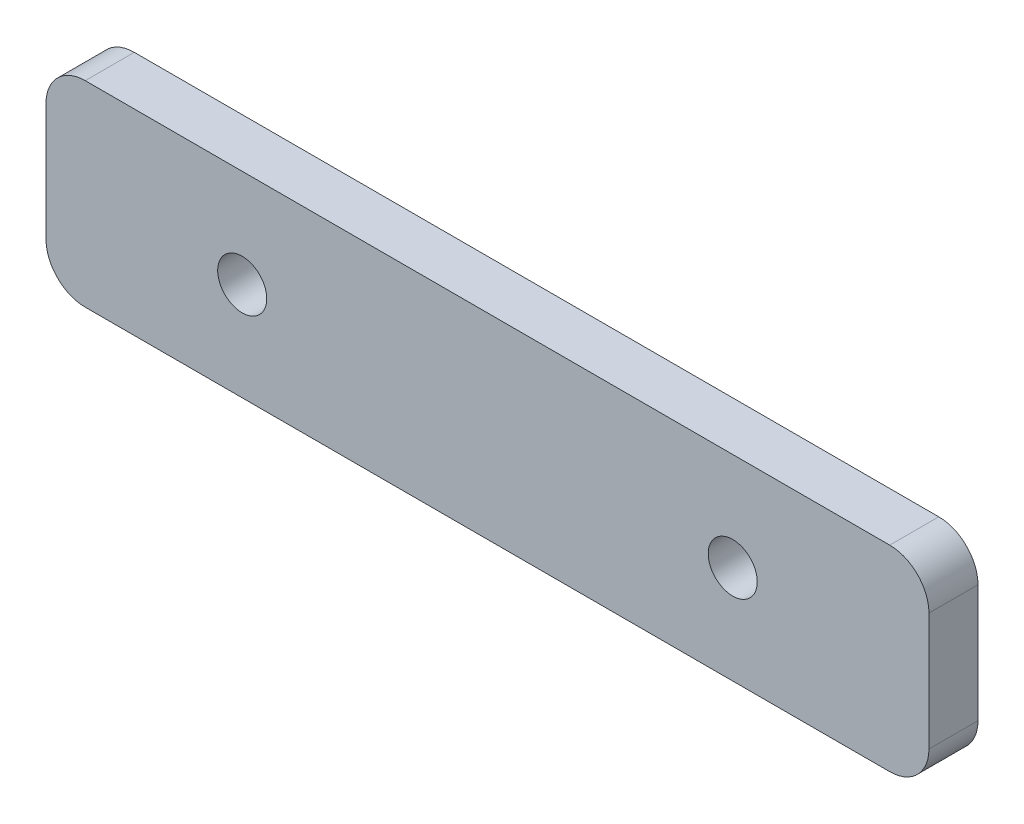
ISO-10303-21;
HEADER;
FILE_DESCRIPTION(('STEP AP214'),'2;1');
FILE_NAME('part.step','',(''),(''),'','','');
FILE_SCHEMA(('AUTOMOTIVE_DESIGN { 1 0 10303 214 1 1 1 1 }'));
ENDSEC;
DATA;
#1=APPLICATION_CONTEXT('core data for automotive mechanical design processes');
#2=APPLICATION_PROTOCOL_DEFINITION('international standard','automotive_design',2000,#1);
#3=PRODUCT_CONTEXT('',#1,'mechanical');
#4=PRODUCT('Part','Part','',(#3));
#5=PRODUCT_RELATED_PRODUCT_CATEGORY('part','',(#4));
#6=PRODUCT_DEFINITION_FORMATION('','',#4);
#7=PRODUCT_DEFINITION_CONTEXT('part definition',#1,'design');
#8=PRODUCT_DEFINITION('design','',#6,#7);
#9=PRODUCT_DEFINITION_SHAPE('','',#8);
#10=(LENGTH_UNIT() NAMED_UNIT(*) SI_UNIT(.MILLI.,.METRE.));
#11=(NAMED_UNIT(*) PLANE_ANGLE_UNIT() SI_UNIT($,.RADIAN.));
#12=(NAMED_UNIT(*) SI_UNIT($,.STERADIAN.) SOLID_ANGLE_UNIT());
#13=UNCERTAINTY_MEASURE_WITH_UNIT(LENGTH_MEASURE(1.E-05),#10,'distance_accuracy_value','');
#14=(GEOMETRIC_REPRESENTATION_CONTEXT(3) GLOBAL_UNCERTAINTY_ASSIGNED_CONTEXT((#13)) GLOBAL_UNIT_ASSIGNED_CONTEXT((#10,
#11,#12)) REPRESENTATION_CONTEXT('',''));
#15=CARTESIAN_POINT('',(0.,0.,0.));
#16=DIRECTION('',(0.,0.,1.));
#17=DIRECTION('',(1.,0.,0.));
#18=AXIS2_PLACEMENT_3D('',#15,#16,#17);
#19=CARTESIAN_POINT('',(0.,0.,3.175));
#20=DIRECTION('',(0.,0.,-1.));
#21=DIRECTION('',(-1.,0.,0.));
#22=AXIS2_PLACEMENT_3D('',#19,#20,#21);
#23=PLANE('',#22);
#24=DIRECTION('',(1.,0.,0.));
#25=VECTOR('',#24,1.);
#26=CARTESIAN_POINT('',(-28.575,-6.35,3.175));
#27=LINE('',#26,#25);
#28=CARTESIAN_POINT('',(-26.035,-6.35,3.175));
#29=VERTEX_POINT('',#28);
#30=CARTESIAN_POINT('',(26.035,-6.35,3.175));
#31=VERTEX_POINT('',#30);
#32=EDGE_CURVE('E140',#29,#31,#27,.T.);
#33=ORIENTED_EDGE('',*,*,#32,.T.);
#34=CARTESIAN_POINT('',(26.035,-3.81,3.175));
#35=DIRECTION('',(0.,0.,-1.));
#36=DIRECTION('',(-1.,0.,0.));
#37=AXIS2_PLACEMENT_3D('',#34,#35,#36);
#38=CIRCLE('',#37,2.54);
#39=CARTESIAN_POINT('',(28.575,-3.81,3.175));
#40=VERTEX_POINT('',#39);
#41=EDGE_CURVE('E158',#31,#40,#38,.F.);
#42=ORIENTED_EDGE('',*,*,#41,.T.);
#43=DIRECTION('',(0.,1.,0.));
#44=VECTOR('',#43,1.);
#45=CARTESIAN_POINT('',(28.575,-6.35,3.175));
#46=LINE('',#45,#44);
#47=CARTESIAN_POINT('',(28.575,3.81,3.175));
#48=VERTEX_POINT('',#47);
#49=EDGE_CURVE('E122',#40,#48,#46,.T.);
#50=ORIENTED_EDGE('',*,*,#49,.T.);
#51=CARTESIAN_POINT('',(26.035,3.81,3.175));
#52=DIRECTION('',(0.,0.,-1.));
#53=DIRECTION('',(-1.,0.,0.));
#54=AXIS2_PLACEMENT_3D('',#51,#52,#53);
#55=CIRCLE('',#54,2.54);
#56=CARTESIAN_POINT('',(26.035,6.35,3.175));
#57=VERTEX_POINT('',#56);
#58=EDGE_CURVE('E154',#48,#57,#55,.F.);
#59=ORIENTED_EDGE('',*,*,#58,.T.);
#60=DIRECTION('',(-1.,0.,0.));
#61=VECTOR('',#60,1.);
#62=CARTESIAN_POINT('',(-28.575,6.35,3.175));
#63=LINE('',#62,#61);
#64=CARTESIAN_POINT('',(-26.035,6.35,3.175));
#65=VERTEX_POINT('',#64);
#66=EDGE_CURVE('E167',#57,#65,#63,.T.);
#67=ORIENTED_EDGE('',*,*,#66,.T.);
#68=CARTESIAN_POINT('',(-26.035,3.81,3.175));
#69=DIRECTION('',(0.,0.,-1.));
#70=DIRECTION('',(-1.,0.,0.));
#71=AXIS2_PLACEMENT_3D('',#68,#69,#70);
#72=CIRCLE('',#71,2.54);
#73=CARTESIAN_POINT('',(-28.575,3.81,3.175));
#74=VERTEX_POINT('',#73);
#75=EDGE_CURVE('E57',#65,#74,#72,.F.);
#76=ORIENTED_EDGE('',*,*,#75,.T.);
#77=DIRECTION('',(0.,-1.,0.));
#78=VECTOR('',#77,1.);
#79=CARTESIAN_POINT('',(-28.575,-6.35,3.175));
#80=LINE('',#79,#78);
#81=CARTESIAN_POINT('',(-28.575,-3.81,3.175));
#82=VERTEX_POINT('',#81);
#83=EDGE_CURVE('E173',#74,#82,#80,.T.);
#84=ORIENTED_EDGE('',*,*,#83,.T.);
#85=CARTESIAN_POINT('',(-26.035,-3.81,3.175));
#86=DIRECTION('',(0.,0.,-1.));
#87=DIRECTION('',(-1.,0.,0.));
#88=AXIS2_PLACEMENT_3D('',#85,#86,#87);
#89=CIRCLE('',#88,2.54);
#90=EDGE_CURVE('E156',#82,#29,#89,.F.);
#91=ORIENTED_EDGE('',*,*,#90,.T.);
#92=EDGE_LOOP('',(#33,#42,#50,#59,#67,#76,#84,#91));
#93=FACE_BOUND('',#92,.T.);
#94=CARTESIAN_POINT('',(-15.875,0.,3.175));
#95=DIRECTION('',(0.,0.,1.));
#96=DIRECTION('',(1.,0.,0.));
#97=AXIS2_PLACEMENT_3D('',#94,#95,#96);
#98=CIRCLE('',#97,1.5875);
#99=CARTESIAN_POINT('',(-14.2875,0.,3.175));
#100=VERTEX_POINT('',#99);
#101=EDGE_CURVE('E131',#100,#100,#98,.T.);
#102=ORIENTED_EDGE('',*,*,#101,.F.);
#103=EDGE_LOOP('',(#102));
#104=FACE_BOUND('',#103,.T.);
#105=CARTESIAN_POINT('',(15.875,0.,3.175));
#106=DIRECTION('',(0.,0.,1.));
#107=DIRECTION('',(1.,0.,0.));
#108=AXIS2_PLACEMENT_3D('',#105,#106,#107);
#109=CIRCLE('',#108,1.5875);
#110=CARTESIAN_POINT('',(17.4625,0.,3.175));
#111=VERTEX_POINT('',#110);
#112=EDGE_CURVE('E188',#111,#111,#109,.T.);
#113=ORIENTED_EDGE('',*,*,#112,.F.);
#114=EDGE_LOOP('',(#113));
#115=FACE_BOUND('',#114,.T.);
#116=ADVANCED_FACE('F35',(#93,#104,#115),#23,.F.);
#117=CARTESIAN_POINT('',(0.,0.,0.));
#118=DIRECTION('',(0.,0.,-1.));
#119=DIRECTION('',(-1.,0.,0.));
#120=AXIS2_PLACEMENT_3D('',#117,#118,#119);
#121=PLANE('',#120);
#122=CARTESIAN_POINT('',(-15.875,0.,0.));
#123=DIRECTION('',(0.,0.,1.));
#124=DIRECTION('',(1.,0.,0.));
#125=AXIS2_PLACEMENT_3D('',#122,#123,#124);
#126=CIRCLE('',#125,1.5875);
#127=CARTESIAN_POINT('',(-14.2875,0.,0.));
#128=VERTEX_POINT('',#127);
#129=EDGE_CURVE('E137',#128,#128,#126,.T.);
#130=ORIENTED_EDGE('',*,*,#129,.T.);
#131=EDGE_LOOP('',(#130));
#132=FACE_BOUND('',#131,.T.);
#133=DIRECTION('',(0.,1.,0.));
#134=VECTOR('',#133,1.);
#135=CARTESIAN_POINT('',(28.575,-6.35,0.));
#136=LINE('',#135,#134);
#137=CARTESIAN_POINT('',(28.575,-3.81,0.));
#138=VERTEX_POINT('',#137);
#139=CARTESIAN_POINT('',(28.575,3.81,0.));
#140=VERTEX_POINT('',#139);
#141=EDGE_CURVE('E119',#138,#140,#136,.T.);
#142=ORIENTED_EDGE('',*,*,#141,.F.);
#143=CARTESIAN_POINT('',(26.035,-3.81,0.));
#144=DIRECTION('',(0.,0.,-1.));
#145=DIRECTION('',(-1.,0.,0.));
#146=AXIS2_PLACEMENT_3D('',#143,#144,#145);
#147=CIRCLE('',#146,2.54);
#148=CARTESIAN_POINT('',(26.035,-6.35,0.));
#149=VERTEX_POINT('',#148);
#150=EDGE_CURVE('E102',#138,#149,#147,.T.);
#151=ORIENTED_EDGE('',*,*,#150,.T.);
#152=DIRECTION('',(1.,0.,0.));
#153=VECTOR('',#152,1.);
#154=CARTESIAN_POINT('',(-28.575,-6.35,0.));
#155=LINE('',#154,#153);
#156=CARTESIAN_POINT('',(-26.035,-6.35,0.));
#157=VERTEX_POINT('',#156);
#158=EDGE_CURVE('E144',#157,#149,#155,.T.);
#159=ORIENTED_EDGE('',*,*,#158,.F.);
#160=CARTESIAN_POINT('',(-26.035,-3.81,0.));
#161=DIRECTION('',(0.,0.,-1.));
#162=DIRECTION('',(-1.,0.,0.));
#163=AXIS2_PLACEMENT_3D('',#160,#161,#162);
#164=CIRCLE('',#163,2.54);
#165=CARTESIAN_POINT('',(-28.575,-3.81,0.));
#166=VERTEX_POINT('',#165);
#167=EDGE_CURVE('E113',#157,#166,#164,.T.);
#168=ORIENTED_EDGE('',*,*,#167,.T.);
#169=DIRECTION('',(0.,-1.,0.));
#170=VECTOR('',#169,1.);
#171=CARTESIAN_POINT('',(-28.575,-6.35,0.));
#172=LINE('',#171,#170);
#173=CARTESIAN_POINT('',(-28.575,3.81,0.));
#174=VERTEX_POINT('',#173);
#175=EDGE_CURVE('E134',#174,#166,#172,.T.);
#176=ORIENTED_EDGE('',*,*,#175,.F.);
#177=CARTESIAN_POINT('',(-26.035,3.81,0.));
#178=DIRECTION('',(0.,0.,-1.));
#179=DIRECTION('',(-1.,0.,0.));
#180=AXIS2_PLACEMENT_3D('',#177,#178,#179);
#181=CIRCLE('',#180,2.54);
#182=CARTESIAN_POINT('',(-26.035,6.35,0.));
#183=VERTEX_POINT('',#182);
#184=EDGE_CURVE('E123',#174,#183,#181,.T.);
#185=ORIENTED_EDGE('',*,*,#184,.T.);
#186=DIRECTION('',(-1.,0.,0.));
#187=VECTOR('',#186,1.);
#188=CARTESIAN_POINT('',(-28.575,6.35,0.));
#189=LINE('',#188,#187);
#190=CARTESIAN_POINT('',(26.035,6.35,0.));
#191=VERTEX_POINT('',#190);
#192=EDGE_CURVE('E130',#191,#183,#189,.T.);
#193=ORIENTED_EDGE('',*,*,#192,.F.);
#194=CARTESIAN_POINT('',(26.035,3.81,0.));
#195=DIRECTION('',(0.,0.,-1.));
#196=DIRECTION('',(-1.,0.,0.));
#197=AXIS2_PLACEMENT_3D('',#194,#195,#196);
#198=CIRCLE('',#197,2.54);
#199=EDGE_CURVE('E129',#191,#140,#198,.T.);
#200=ORIENTED_EDGE('',*,*,#199,.T.);
#201=EDGE_LOOP('',(#142,#151,#159,#168,#176,#185,#193,#200));
#202=FACE_BOUND('',#201,.T.);
#203=CARTESIAN_POINT('',(15.875,0.,0.));
#204=DIRECTION('',(0.,0.,1.));
#205=DIRECTION('',(1.,0.,0.));
#206=AXIS2_PLACEMENT_3D('',#203,#204,#205);
#207=CIRCLE('',#206,1.5875);
#208=CARTESIAN_POINT('',(17.4625,0.,0.));
#209=VERTEX_POINT('',#208);
#210=EDGE_CURVE('E190',#209,#209,#207,.T.);
#211=ORIENTED_EDGE('',*,*,#210,.T.);
#212=EDGE_LOOP('',(#211));
#213=FACE_BOUND('',#212,.T.);
#214=ADVANCED_FACE('F126',(#132,#202,#213),#121,.T.);
#215=CARTESIAN_POINT('',(28.575,-6.35,3.175));
#216=DIRECTION('',(-1.,0.,0.));
#217=DIRECTION('',(0.,0.,1.));
#218=AXIS2_PLACEMENT_3D('',#215,#216,#217);
#219=PLANE('',#218);
#220=ORIENTED_EDGE('',*,*,#49,.F.);
#221=DIRECTION('',(0.,0.,-1.));
#222=VECTOR('',#221,1.);
#223=CARTESIAN_POINT('',(28.575,-3.81,3.175));
#224=LINE('',#223,#222);
#225=EDGE_CURVE('E106',#40,#138,#224,.T.);
#226=ORIENTED_EDGE('',*,*,#225,.T.);
#227=ORIENTED_EDGE('',*,*,#141,.T.);
#228=DIRECTION('',(0.,0.,-1.));
#229=VECTOR('',#228,1.);
#230=CARTESIAN_POINT('',(28.575,3.81,3.175));
#231=LINE('',#230,#229);
#232=EDGE_CURVE('E124',#140,#48,#231,.F.);
#233=ORIENTED_EDGE('',*,*,#232,.T.);
#234=EDGE_LOOP('',(#220,#226,#227,#233));
#235=FACE_BOUND('',#234,.T.);
#236=ADVANCED_FACE('F118',(#235),#219,.F.);
#237=CARTESIAN_POINT('',(-28.575,6.35,3.175));
#238=DIRECTION('',(0.,-1.,0.));
#239=DIRECTION('',(1.,0.,0.));
#240=AXIS2_PLACEMENT_3D('',#237,#238,#239);
#241=PLANE('',#240);
#242=ORIENTED_EDGE('',*,*,#66,.F.);
#243=DIRECTION('',(0.,0.,-1.));
#244=VECTOR('',#243,1.);
#245=CARTESIAN_POINT('',(26.035,6.35,3.175));
#246=LINE('',#245,#244);
#247=EDGE_CURVE('E11',#57,#191,#246,.T.);
#248=ORIENTED_EDGE('',*,*,#247,.T.);
#249=ORIENTED_EDGE('',*,*,#192,.T.);
#250=DIRECTION('',(0.,0.,-1.));
#251=VECTOR('',#250,1.);
#252=CARTESIAN_POINT('',(-26.035,6.35,3.175));
#253=LINE('',#252,#251);
#254=EDGE_CURVE('E43',#183,#65,#253,.F.);
#255=ORIENTED_EDGE('',*,*,#254,.T.);
#256=EDGE_LOOP('',(#242,#248,#249,#255));
#257=FACE_BOUND('',#256,.T.);
#258=ADVANCED_FACE('F166',(#257),#241,.F.);
#259=CARTESIAN_POINT('',(-28.575,-6.35,3.175));
#260=DIRECTION('',(1.,0.,0.));
#261=DIRECTION('',(0.,0.,-1.));
#262=AXIS2_PLACEMENT_3D('',#259,#260,#261);
#263=PLANE('',#262);
#264=ORIENTED_EDGE('',*,*,#175,.T.);
#265=DIRECTION('',(0.,0.,-1.));
#266=VECTOR('',#265,1.);
#267=CARTESIAN_POINT('',(-28.575,-3.81,3.175));
#268=LINE('',#267,#266);
#269=EDGE_CURVE('E50',#166,#82,#268,.F.);
#270=ORIENTED_EDGE('',*,*,#269,.T.);
#271=ORIENTED_EDGE('',*,*,#83,.F.);
#272=DIRECTION('',(0.,0.,-1.));
#273=VECTOR('',#272,1.);
#274=CARTESIAN_POINT('',(-28.575,3.81,3.175));
#275=LINE('',#274,#273);
#276=EDGE_CURVE('E160',#74,#174,#275,.T.);
#277=ORIENTED_EDGE('',*,*,#276,.T.);
#278=EDGE_LOOP('',(#264,#270,#271,#277));
#279=FACE_BOUND('',#278,.T.);
#280=ADVANCED_FACE('F177',(#279),#263,.F.);
#281=CARTESIAN_POINT('',(-28.575,-6.35,3.175));
#282=DIRECTION('',(0.,1.,0.));
#283=DIRECTION('',(0.,0.,1.));
#284=AXIS2_PLACEMENT_3D('',#281,#282,#283);
#285=PLANE('',#284);
#286=ORIENTED_EDGE('',*,*,#158,.T.);
#287=DIRECTION('',(0.,0.,-1.));
#288=VECTOR('',#287,1.);
#289=CARTESIAN_POINT('',(26.035,-6.35,3.175));
#290=LINE('',#289,#288);
#291=EDGE_CURVE('E107',#149,#31,#290,.F.);
#292=ORIENTED_EDGE('',*,*,#291,.T.);
#293=ORIENTED_EDGE('',*,*,#32,.F.);
#294=DIRECTION('',(0.,0.,-1.));
#295=VECTOR('',#294,1.);
#296=CARTESIAN_POINT('',(-26.035,-6.35,3.175));
#297=LINE('',#296,#295);
#298=EDGE_CURVE('E112',#29,#157,#297,.T.);
#299=ORIENTED_EDGE('',*,*,#298,.T.);
#300=EDGE_LOOP('',(#286,#292,#293,#299));
#301=FACE_BOUND('',#300,.T.);
#302=ADVANCED_FACE('F184',(#301),#285,.F.);
#303=CARTESIAN_POINT('',(-15.875,0.,3.175));
#304=DIRECTION('',(0.,0.,-1.));
#305=DIRECTION('',(-1.,0.,0.));
#306=AXIS2_PLACEMENT_3D('',#303,#304,#305);
#307=CYLINDRICAL_SURFACE('',#306,1.5875);
#308=ORIENTED_EDGE('',*,*,#101,.T.);
#309=EDGE_LOOP('',(#308));
#310=FACE_BOUND('',#309,.T.);
#311=ORIENTED_EDGE('',*,*,#129,.F.);
#312=EDGE_LOOP('',(#311));
#313=FACE_BOUND('',#312,.T.);
#314=ADVANCED_FACE('F207',(#310,#313),#307,.F.);
#315=CARTESIAN_POINT('',(15.875,0.,3.175));
#316=DIRECTION('',(0.,0.,-1.));
#317=DIRECTION('',(-1.,0.,0.));
#318=AXIS2_PLACEMENT_3D('',#315,#316,#317);
#319=CYLINDRICAL_SURFACE('',#318,1.5875);
#320=ORIENTED_EDGE('',*,*,#112,.T.);
#321=EDGE_LOOP('',(#320));
#322=FACE_BOUND('',#321,.T.);
#323=ORIENTED_EDGE('',*,*,#210,.F.);
#324=EDGE_LOOP('',(#323));
#325=FACE_BOUND('',#324,.T.);
#326=ADVANCED_FACE('F196',(#322,#325),#319,.F.);
#327=CARTESIAN_POINT('',(26.035,-3.81,3.175));
#328=DIRECTION('',(0.,0.,-1.));
#329=DIRECTION('',(-1.,0.,0.));
#330=AXIS2_PLACEMENT_3D('',#327,#328,#329);
#331=CYLINDRICAL_SURFACE('',#330,2.54);
#332=ORIENTED_EDGE('',*,*,#41,.F.);
#333=ORIENTED_EDGE('',*,*,#291,.F.);
#334=ORIENTED_EDGE('',*,*,#150,.F.);
#335=ORIENTED_EDGE('',*,*,#225,.F.);
#336=EDGE_LOOP('',(#332,#333,#334,#335));
#337=FACE_BOUND('',#336,.T.);
#338=ADVANCED_FACE('F105',(#337),#331,.T.);
#339=CARTESIAN_POINT('',(-26.035,-3.81,3.175));
#340=DIRECTION('',(0.,0.,-1.));
#341=DIRECTION('',(-1.,0.,0.));
#342=AXIS2_PLACEMENT_3D('',#339,#340,#341);
#343=CYLINDRICAL_SURFACE('',#342,2.54);
#344=ORIENTED_EDGE('',*,*,#90,.F.);
#345=ORIENTED_EDGE('',*,*,#269,.F.);
#346=ORIENTED_EDGE('',*,*,#167,.F.);
#347=ORIENTED_EDGE('',*,*,#298,.F.);
#348=EDGE_LOOP('',(#344,#345,#346,#347));
#349=FACE_BOUND('',#348,.T.);
#350=ADVANCED_FACE('F181',(#349),#343,.T.);
#351=CARTESIAN_POINT('',(26.035,3.81,3.175));
#352=DIRECTION('',(0.,0.,-1.));
#353=DIRECTION('',(-1.,0.,0.));
#354=AXIS2_PLACEMENT_3D('',#351,#352,#353);
#355=CYLINDRICAL_SURFACE('',#354,2.54);
#356=ORIENTED_EDGE('',*,*,#58,.F.);
#357=ORIENTED_EDGE('',*,*,#232,.F.);
#358=ORIENTED_EDGE('',*,*,#199,.F.);
#359=ORIENTED_EDGE('',*,*,#247,.F.);
#360=EDGE_LOOP('',(#356,#357,#358,#359));
#361=FACE_BOUND('',#360,.T.);
#362=ADVANCED_FACE('F221',(#361),#355,.T.);
#363=CARTESIAN_POINT('',(-26.035,3.81,3.175));
#364=DIRECTION('',(0.,0.,-1.));
#365=DIRECTION('',(-1.,0.,0.));
#366=AXIS2_PLACEMENT_3D('',#363,#364,#365);
#367=CYLINDRICAL_SURFACE('',#366,2.54);
#368=ORIENTED_EDGE('',*,*,#75,.F.);
#369=ORIENTED_EDGE('',*,*,#254,.F.);
#370=ORIENTED_EDGE('',*,*,#184,.F.);
#371=ORIENTED_EDGE('',*,*,#276,.F.);
#372=EDGE_LOOP('',(#368,#369,#370,#371));
#373=FACE_BOUND('',#372,.T.);
#374=ADVANCED_FACE('F37',(#373),#367,.T.);
#375=CLOSED_SHELL('',(#116,#214,#236,#258,#280,#302,#314,#326,#338,#350,#362,#374));
#376=MANIFOLD_SOLID_BREP('B2',#375);
#377=ADVANCED_BREP_SHAPE_REPRESENTATION('',(#18,#376),#14);
#378=SHAPE_DEFINITION_REPRESENTATION(#9,#377);
ENDSEC;
END-ISO-10303-21;
